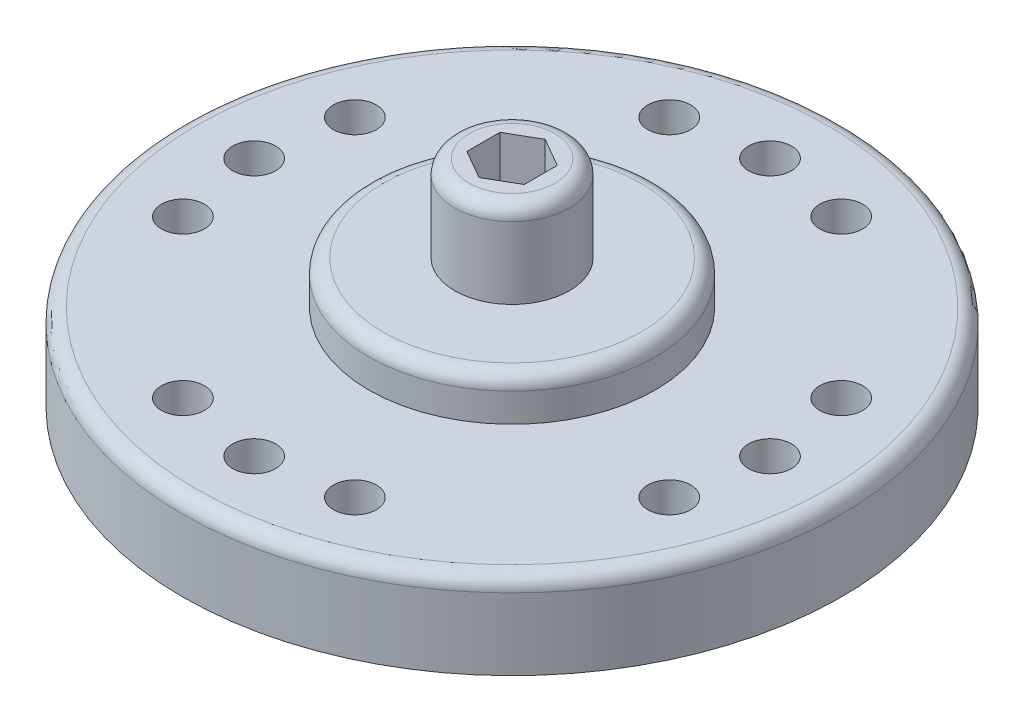
ISO-10303-21;
HEADER;
FILE_DESCRIPTION(('STEP AP214'),'2;1');
FILE_NAME('part.step','',(''),(''),'','','');
FILE_SCHEMA(('AUTOMOTIVE_DESIGN { 1 0 10303 214 1 1 1 1 }'));
ENDSEC;
DATA;
#1=APPLICATION_CONTEXT('core data for automotive mechanical design processes');
#2=APPLICATION_PROTOCOL_DEFINITION('international standard','automotive_design',2000,#1);
#3=PRODUCT_CONTEXT('',#1,'mechanical');
#4=PRODUCT('Part','Part','',(#3));
#5=PRODUCT_RELATED_PRODUCT_CATEGORY('part','',(#4));
#6=PRODUCT_DEFINITION_FORMATION('','',#4);
#7=PRODUCT_DEFINITION_CONTEXT('part definition',#1,'design');
#8=PRODUCT_DEFINITION('design','',#6,#7);
#9=PRODUCT_DEFINITION_SHAPE('','',#8);
#10=(LENGTH_UNIT() NAMED_UNIT(*) SI_UNIT(.MILLI.,.METRE.));
#11=(NAMED_UNIT(*) PLANE_ANGLE_UNIT() SI_UNIT($,.RADIAN.));
#12=(NAMED_UNIT(*) SI_UNIT($,.STERADIAN.) SOLID_ANGLE_UNIT());
#13=UNCERTAINTY_MEASURE_WITH_UNIT(LENGTH_MEASURE(1.E-05),#10,'distance_accuracy_value','');
#14=(GEOMETRIC_REPRESENTATION_CONTEXT(3) GLOBAL_UNCERTAINTY_ASSIGNED_CONTEXT((#13)) GLOBAL_UNIT_ASSIGNED_CONTEXT((#10,
#11,#12)) REPRESENTATION_CONTEXT('',''));
#15=CARTESIAN_POINT('',(0.,0.,0.));
#16=DIRECTION('',(0.,0.,1.));
#17=DIRECTION('',(1.,0.,0.));
#18=AXIS2_PLACEMENT_3D('',#15,#16,#17);
#19=CARTESIAN_POINT('',(0.,4.5,-13.3));
#20=DIRECTION('',(0.,1.,0.));
#21=DIRECTION('',(0.,0.,1.));
#22=AXIS2_PLACEMENT_3D('',#19,#20,#21);
#23=PLANE('',#22);
#24=CARTESIAN_POINT('',(0.,4.5,-13.3));
#25=DIRECTION('',(0.,1.,0.));
#26=DIRECTION('',(0.,0.,1.));
#27=AXIS2_PLACEMENT_3D('',#24,#25,#26);
#28=CIRCLE('',#27,4.5);
#29=CARTESIAN_POINT('',(0.,4.5,-8.79999999999999));
#30=VERTEX_POINT('',#29);
#31=EDGE_CURVE('E251',#30,#30,#28,.T.);
#32=ORIENTED_EDGE('',*,*,#31,.T.);
#33=EDGE_LOOP('',(#32));
#34=FACE_BOUND('',#33,.T.);
#35=CARTESIAN_POINT('',(0.,4.5,-13.3));
#36=DIRECTION('',(0.,1.,0.));
#37=DIRECTION('',(0.,0.,1.));
#38=AXIS2_PLACEMENT_3D('',#35,#36,#37);
#39=CIRCLE('',#38,2.);
#40=CARTESIAN_POINT('',(0.,4.5,-11.3));
#41=VERTEX_POINT('',#40);
#42=EDGE_CURVE('E157',#41,#41,#39,.T.);
#43=ORIENTED_EDGE('',*,*,#42,.F.);
#44=EDGE_LOOP('',(#43));
#45=FACE_BOUND('',#44,.T.);
#46=ADVANCED_FACE('F56',(#34,#45),#23,.T.);
#47=CARTESIAN_POINT('',(0.,3.,-13.3));
#48=DIRECTION('',(0.,1.,0.));
#49=DIRECTION('',(0.,0.,1.));
#50=AXIS2_PLACEMENT_3D('',#47,#48,#49);
#51=PLANE('',#50);
#52=CARTESIAN_POINT('',(0.,3.,-13.3));
#53=DIRECTION('',(0.,1.,0.));
#54=DIRECTION('',(0.,0.,1.));
#55=AXIS2_PLACEMENT_3D('',#52,#53,#54);
#56=CIRCLE('',#55,11.);
#57=CARTESIAN_POINT('',(0.,3.,-2.3));
#58=VERTEX_POINT('',#57);
#59=EDGE_CURVE('E257',#58,#58,#56,.T.);
#60=ORIENTED_EDGE('',*,*,#59,.T.);
#61=EDGE_LOOP('',(#60));
#62=FACE_BOUND('',#61,.T.);
#63=CARTESIAN_POINT('',(8.48528137423861,3.,-10.3000000000001));
#64=DIRECTION('',(0.,1.,0.));
#65=DIRECTION('',(-1.,0.,0.));
#66=AXIS2_PLACEMENT_3D('',#63,#64,#65);
#67=CIRCLE('',#66,0.75);
#68=CARTESIAN_POINT('',(7.7352813742386,3.,-10.3000000000001));
#69=VERTEX_POINT('',#68);
#70=EDGE_CURVE('E177',#69,#69,#67,.T.);
#71=ORIENTED_EDGE('',*,*,#70,.F.);
#72=EDGE_LOOP('',(#71));
#73=FACE_BOUND('',#72,.T.);
#74=CARTESIAN_POINT('',(-3.,3.,-4.81471862576142));
#75=DIRECTION('',(0.,1.,0.));
#76=DIRECTION('',(0.,0.,-1.));
#77=AXIS2_PLACEMENT_3D('',#74,#75,#76);
#78=CIRCLE('',#77,0.75);
#79=CARTESIAN_POINT('',(-3.,3.,-5.56471862576142));
#80=VERTEX_POINT('',#79);
#81=EDGE_CURVE('E195',#80,#80,#78,.T.);
#82=ORIENTED_EDGE('',*,*,#81,.F.);
#83=EDGE_LOOP('',(#82));
#84=FACE_BOUND('',#83,.T.);
#85=CARTESIAN_POINT('',(-8.48528137423858,3.,-16.3));
#86=DIRECTION('',(0.,1.,0.));
#87=DIRECTION('',(1.,0.,0.));
#88=AXIS2_PLACEMENT_3D('',#85,#86,#87);
#89=CIRCLE('',#88,0.75);
#90=CARTESIAN_POINT('',(-7.73528137423858,3.,-16.3));
#91=VERTEX_POINT('',#90);
#92=EDGE_CURVE('E213',#91,#91,#89,.T.);
#93=ORIENTED_EDGE('',*,*,#92,.F.);
#94=EDGE_LOOP('',(#93));
#95=FACE_BOUND('',#94,.T.);
#96=CARTESIAN_POINT('',(3.,3.,-21.7852813742386));
#97=DIRECTION('',(0.,1.,0.));
#98=DIRECTION('',(0.,0.,1.));
#99=AXIS2_PLACEMENT_3D('',#96,#97,#98);
#100=CIRCLE('',#99,0.75);
#101=CARTESIAN_POINT('',(3.,3.,-21.0352813742386));
#102=VERTEX_POINT('',#101);
#103=EDGE_CURVE('E228',#102,#102,#100,.T.);
#104=ORIENTED_EDGE('',*,*,#103,.F.);
#105=EDGE_LOOP('',(#104));
#106=FACE_BOUND('',#105,.T.);
#107=CARTESIAN_POINT('',(0.,3.,-22.3));
#108=DIRECTION('',(0.,1.,0.));
#109=DIRECTION('',(0.,0.,1.));
#110=AXIS2_PLACEMENT_3D('',#107,#108,#109);
#111=CIRCLE('',#110,0.750000000000001);
#112=CARTESIAN_POINT('',(0.,3.,-21.55));
#113=VERTEX_POINT('',#112);
#114=EDGE_CURVE('E237',#113,#113,#111,.T.);
#115=ORIENTED_EDGE('',*,*,#114,.F.);
#116=EDGE_LOOP('',(#115));
#117=FACE_BOUND('',#116,.T.);
#118=CARTESIAN_POINT('',(-3.,3.,-21.7852813742386));
#119=DIRECTION('',(0.,-1.,0.));
#120=DIRECTION('',(0.,0.,-1.));
#121=AXIS2_PLACEMENT_3D('',#118,#119,#120);
#122=CIRCLE('',#121,0.75);
#123=CARTESIAN_POINT('',(-3.,3.,-22.5352813742386));
#124=VERTEX_POINT('',#123);
#125=EDGE_CURVE('E222',#124,#124,#122,.T.);
#126=ORIENTED_EDGE('',*,*,#125,.T.);
#127=EDGE_LOOP('',(#126));
#128=FACE_BOUND('',#127,.T.);
#129=CARTESIAN_POINT('',(-9.,3.,-13.3));
#130=DIRECTION('',(0.,1.,0.));
#131=DIRECTION('',(1.,0.,0.));
#132=AXIS2_PLACEMENT_3D('',#129,#130,#131);
#133=CIRCLE('',#132,0.750000000000001);
#134=CARTESIAN_POINT('',(-8.24999999999999,3.,-13.3));
#135=VERTEX_POINT('',#134);
#136=EDGE_CURVE('E219',#135,#135,#133,.T.);
#137=ORIENTED_EDGE('',*,*,#136,.F.);
#138=EDGE_LOOP('',(#137));
#139=FACE_BOUND('',#138,.T.);
#140=CARTESIAN_POINT('',(-8.48528137423856,3.,-10.3));
#141=DIRECTION('',(0.,-1.,0.));
#142=DIRECTION('',(-1.,0.,0.));
#143=AXIS2_PLACEMENT_3D('',#140,#141,#142);
#144=CIRCLE('',#143,0.75);
#145=CARTESIAN_POINT('',(-9.23528137423856,3.,-10.3));
#146=VERTEX_POINT('',#145);
#147=EDGE_CURVE('E207',#146,#146,#144,.T.);
#148=ORIENTED_EDGE('',*,*,#147,.T.);
#149=EDGE_LOOP('',(#148));
#150=FACE_BOUND('',#149,.T.);
#151=CARTESIAN_POINT('',(0.,3.,-4.3));
#152=DIRECTION('',(0.,1.,0.));
#153=DIRECTION('',(0.,0.,-1.));
#154=AXIS2_PLACEMENT_3D('',#151,#152,#153);
#155=CIRCLE('',#154,0.750000000000001);
#156=CARTESIAN_POINT('',(0.,3.,-5.05));
#157=VERTEX_POINT('',#156);
#158=EDGE_CURVE('E201',#157,#157,#155,.T.);
#159=ORIENTED_EDGE('',*,*,#158,.F.);
#160=EDGE_LOOP('',(#159));
#161=FACE_BOUND('',#160,.T.);
#162=CARTESIAN_POINT('',(3.,3.,-4.81471862576142));
#163=DIRECTION('',(0.,-1.,0.));
#164=DIRECTION('',(0.,0.,1.));
#165=AXIS2_PLACEMENT_3D('',#162,#163,#164);
#166=CIRCLE('',#165,0.75);
#167=CARTESIAN_POINT('',(3.,3.,-4.06471862576142));
#168=VERTEX_POINT('',#167);
#169=EDGE_CURVE('E189',#168,#168,#166,.T.);
#170=ORIENTED_EDGE('',*,*,#169,.T.);
#171=EDGE_LOOP('',(#170));
#172=FACE_BOUND('',#171,.T.);
#173=CARTESIAN_POINT('',(9.,3.,-13.3000000000001));
#174=DIRECTION('',(0.,1.,0.));
#175=DIRECTION('',(-1.,0.,0.));
#176=AXIS2_PLACEMENT_3D('',#173,#174,#175);
#177=CIRCLE('',#176,0.750000000000001);
#178=CARTESIAN_POINT('',(8.25,3.,-13.3000000000001));
#179=VERTEX_POINT('',#178);
#180=EDGE_CURVE('E183',#179,#179,#177,.T.);
#181=ORIENTED_EDGE('',*,*,#180,.F.);
#182=EDGE_LOOP('',(#181));
#183=FACE_BOUND('',#182,.T.);
#184=CARTESIAN_POINT('',(8.48528137423854,3.,-16.3000000000001));
#185=DIRECTION('',(0.,-1.,0.));
#186=DIRECTION('',(1.,0.,0.));
#187=AXIS2_PLACEMENT_3D('',#184,#185,#186);
#188=CIRCLE('',#187,0.75);
#189=CARTESIAN_POINT('',(9.23528137423854,3.,-16.3000000000001));
#190=VERTEX_POINT('',#189);
#191=EDGE_CURVE('E171',#190,#190,#188,.T.);
#192=ORIENTED_EDGE('',*,*,#191,.T.);
#193=EDGE_LOOP('',(#192));
#194=FACE_BOUND('',#193,.T.);
#195=CARTESIAN_POINT('',(0.,3.,-13.3));
#196=DIRECTION('',(0.,1.,0.));
#197=DIRECTION('',(0.,0.,1.));
#198=AXIS2_PLACEMENT_3D('',#195,#196,#197);
#199=CIRCLE('',#198,5.);
#200=CARTESIAN_POINT('',(0.,3.,-8.29999999999999));
#201=VERTEX_POINT('',#200);
#202=EDGE_CURVE('E167',#201,#201,#199,.T.);
#203=ORIENTED_EDGE('',*,*,#202,.F.);
#204=EDGE_LOOP('',(#203));
#205=FACE_BOUND('',#204,.T.);
#206=ADVANCED_FACE('F271',(#62,#73,#84,#95,#106,#117,#128,#139,#150,#161,#172,#183,#194,#205),
#51,.T.);
#207=CARTESIAN_POINT('',(0.,0.,-13.3));
#208=DIRECTION('',(0.,1.,0.));
#209=DIRECTION('',(0.,0.,1.));
#210=AXIS2_PLACEMENT_3D('',#207,#208,#209);
#211=PLANE('',#210);
#212=CARTESIAN_POINT('',(0.,0.,-13.3));
#213=DIRECTION('',(0.,1.,0.));
#214=DIRECTION('',(0.,0.,1.));
#215=AXIS2_PLACEMENT_3D('',#212,#213,#214);
#216=CIRCLE('',#215,5.);
#217=CARTESIAN_POINT('',(0.,0.,-8.29999999999999));
#218=VERTEX_POINT('',#217);
#219=EDGE_CURVE('E133',#218,#218,#216,.T.);
#220=ORIENTED_EDGE('',*,*,#219,.T.);
#221=EDGE_LOOP('',(#220));
#222=FACE_BOUND('',#221,.T.);
#223=CARTESIAN_POINT('',(8.48528137423854,0.,-16.3000000000001));
#224=DIRECTION('',(0.,-1.,0.));
#225=DIRECTION('',(1.,0.,0.));
#226=AXIS2_PLACEMENT_3D('',#223,#224,#225);
#227=CIRCLE('',#226,0.75);
#228=CARTESIAN_POINT('',(9.23528137423854,0.,-16.3000000000001));
#229=VERTEX_POINT('',#228);
#230=EDGE_CURVE('E170',#229,#229,#227,.T.);
#231=ORIENTED_EDGE('',*,*,#230,.F.);
#232=EDGE_LOOP('',(#231));
#233=FACE_BOUND('',#232,.T.);
#234=CARTESIAN_POINT('',(3.,0.,-4.81471862576142));
#235=DIRECTION('',(0.,-1.,0.));
#236=DIRECTION('',(0.,0.,1.));
#237=AXIS2_PLACEMENT_3D('',#234,#235,#236);
#238=CIRCLE('',#237,0.75);
#239=CARTESIAN_POINT('',(3.,0.,-4.06471862576142));
#240=VERTEX_POINT('',#239);
#241=EDGE_CURVE('E186',#240,#240,#238,.T.);
#242=ORIENTED_EDGE('',*,*,#241,.F.);
#243=EDGE_LOOP('',(#242));
#244=FACE_BOUND('',#243,.T.);
#245=CARTESIAN_POINT('',(-8.48528137423856,0.,-10.3));
#246=DIRECTION('',(0.,-1.,0.));
#247=DIRECTION('',(-1.,0.,0.));
#248=AXIS2_PLACEMENT_3D('',#245,#246,#247);
#249=CIRCLE('',#248,0.75);
#250=CARTESIAN_POINT('',(-9.23528137423856,0.,-10.3));
#251=VERTEX_POINT('',#250);
#252=EDGE_CURVE('E204',#251,#251,#249,.T.);
#253=ORIENTED_EDGE('',*,*,#252,.F.);
#254=EDGE_LOOP('',(#253));
#255=FACE_BOUND('',#254,.T.);
#256=CARTESIAN_POINT('',(-3.,0.,-21.7852813742386));
#257=DIRECTION('',(0.,-1.,0.));
#258=DIRECTION('',(0.,0.,-1.));
#259=AXIS2_PLACEMENT_3D('',#256,#257,#258);
#260=CIRCLE('',#259,0.75);
#261=CARTESIAN_POINT('',(-3.,0.,-22.5352813742386));
#262=VERTEX_POINT('',#261);
#263=EDGE_CURVE('E225',#262,#262,#260,.T.);
#264=ORIENTED_EDGE('',*,*,#263,.F.);
#265=EDGE_LOOP('',(#264));
#266=FACE_BOUND('',#265,.T.);
#267=CARTESIAN_POINT('',(0.,0.,-13.3));
#268=DIRECTION('',(0.,1.,0.));
#269=DIRECTION('',(0.,0.,1.));
#270=AXIS2_PLACEMENT_3D('',#267,#268,#269);
#271=CIRCLE('',#270,11.5);
#272=CARTESIAN_POINT('',(0.,0.,-1.8));
#273=VERTEX_POINT('',#272);
#274=EDGE_CURVE('E240',#273,#273,#271,.T.);
#275=ORIENTED_EDGE('',*,*,#274,.F.);
#276=EDGE_LOOP('',(#275));
#277=FACE_BOUND('',#276,.T.);
#278=CARTESIAN_POINT('',(0.,0.,-22.3));
#279=DIRECTION('',(0.,1.,0.));
#280=DIRECTION('',(0.,0.,1.));
#281=AXIS2_PLACEMENT_3D('',#278,#279,#280);
#282=CIRCLE('',#281,0.750000000000001);
#283=CARTESIAN_POINT('',(0.,0.,-21.55));
#284=VERTEX_POINT('',#283);
#285=EDGE_CURVE('E234',#284,#284,#282,.T.);
#286=ORIENTED_EDGE('',*,*,#285,.T.);
#287=EDGE_LOOP('',(#286));
#288=FACE_BOUND('',#287,.T.);
#289=CARTESIAN_POINT('',(3.,0.,-21.7852813742386));
#290=DIRECTION('',(0.,1.,0.));
#291=DIRECTION('',(0.,0.,1.));
#292=AXIS2_PLACEMENT_3D('',#289,#290,#291);
#293=CIRCLE('',#292,0.75);
#294=CARTESIAN_POINT('',(3.,0.,-21.0352813742386));
#295=VERTEX_POINT('',#294);
#296=EDGE_CURVE('E231',#295,#295,#293,.T.);
#297=ORIENTED_EDGE('',*,*,#296,.T.);
#298=EDGE_LOOP('',(#297));
#299=FACE_BOUND('',#298,.T.);
#300=CARTESIAN_POINT('',(-9.,0.,-13.3));
#301=DIRECTION('',(0.,1.,0.));
#302=DIRECTION('',(1.,0.,0.));
#303=AXIS2_PLACEMENT_3D('',#300,#301,#302);
#304=CIRCLE('',#303,0.750000000000001);
#305=CARTESIAN_POINT('',(-8.24999999999999,0.,-13.3));
#306=VERTEX_POINT('',#305);
#307=EDGE_CURVE('E216',#306,#306,#304,.T.);
#308=ORIENTED_EDGE('',*,*,#307,.T.);
#309=EDGE_LOOP('',(#308));
#310=FACE_BOUND('',#309,.T.);
#311=CARTESIAN_POINT('',(-8.48528137423858,0.,-16.3));
#312=DIRECTION('',(0.,1.,0.));
#313=DIRECTION('',(1.,0.,0.));
#314=AXIS2_PLACEMENT_3D('',#311,#312,#313);
#315=CIRCLE('',#314,0.75);
#316=CARTESIAN_POINT('',(-7.73528137423858,0.,-16.3));
#317=VERTEX_POINT('',#316);
#318=EDGE_CURVE('E210',#317,#317,#315,.T.);
#319=ORIENTED_EDGE('',*,*,#318,.T.);
#320=EDGE_LOOP('',(#319));
#321=FACE_BOUND('',#320,.T.);
#322=CARTESIAN_POINT('',(0.,0.,-4.3));
#323=DIRECTION('',(0.,1.,0.));
#324=DIRECTION('',(0.,0.,-1.));
#325=AXIS2_PLACEMENT_3D('',#322,#323,#324);
#326=CIRCLE('',#325,0.750000000000001);
#327=CARTESIAN_POINT('',(0.,0.,-5.05));
#328=VERTEX_POINT('',#327);
#329=EDGE_CURVE('E198',#328,#328,#326,.T.);
#330=ORIENTED_EDGE('',*,*,#329,.T.);
#331=EDGE_LOOP('',(#330));
#332=FACE_BOUND('',#331,.T.);
#333=CARTESIAN_POINT('',(-3.,0.,-4.81471862576142));
#334=DIRECTION('',(0.,1.,0.));
#335=DIRECTION('',(0.,0.,-1.));
#336=AXIS2_PLACEMENT_3D('',#333,#334,#335);
#337=CIRCLE('',#336,0.75);
#338=CARTESIAN_POINT('',(-3.,0.,-5.56471862576142));
#339=VERTEX_POINT('',#338);
#340=EDGE_CURVE('E192',#339,#339,#337,.T.);
#341=ORIENTED_EDGE('',*,*,#340,.T.);
#342=EDGE_LOOP('',(#341));
#343=FACE_BOUND('',#342,.T.);
#344=CARTESIAN_POINT('',(9.,0.,-13.3000000000001));
#345=DIRECTION('',(0.,1.,0.));
#346=DIRECTION('',(-1.,0.,0.));
#347=AXIS2_PLACEMENT_3D('',#344,#345,#346);
#348=CIRCLE('',#347,0.750000000000001);
#349=CARTESIAN_POINT('',(8.25,0.,-13.3000000000001));
#350=VERTEX_POINT('',#349);
#351=EDGE_CURVE('E180',#350,#350,#348,.T.);
#352=ORIENTED_EDGE('',*,*,#351,.T.);
#353=EDGE_LOOP('',(#352));
#354=FACE_BOUND('',#353,.T.);
#355=CARTESIAN_POINT('',(8.48528137423861,0.,-10.3000000000001));
#356=DIRECTION('',(0.,1.,0.));
#357=DIRECTION('',(-1.,0.,0.));
#358=AXIS2_PLACEMENT_3D('',#355,#356,#357);
#359=CIRCLE('',#358,0.75);
#360=CARTESIAN_POINT('',(7.7352813742386,0.,-10.3000000000001));
#361=VERTEX_POINT('',#360);
#362=EDGE_CURVE('E174',#361,#361,#359,.T.);
#363=ORIENTED_EDGE('',*,*,#362,.T.);
#364=EDGE_LOOP('',(#363));
#365=FACE_BOUND('',#364,.T.);
#366=ADVANCED_FACE('F274',(#222,#233,#244,#255,#266,#277,#288,#299,#310,#321,#332,#343,#354,
#365),#211,.F.);
#367=CARTESIAN_POINT('',(0.,3.,-13.3));
#368=DIRECTION('',(0.,-1.,0.));
#369=DIRECTION('',(0.,0.,-1.));
#370=AXIS2_PLACEMENT_3D('',#367,#368,#369);
#371=CYLINDRICAL_SURFACE('',#370,11.5);
#372=CARTESIAN_POINT('',(0.,2.5,-13.3));
#373=DIRECTION('',(0.,1.,0.));
#374=DIRECTION('',(0.,0.,1.));
#375=AXIS2_PLACEMENT_3D('',#372,#373,#374);
#376=CIRCLE('',#375,11.5);
#377=CARTESIAN_POINT('',(0.,2.5,-1.8));
#378=VERTEX_POINT('',#377);
#379=EDGE_CURVE('E64',#378,#378,#376,.F.);
#380=ORIENTED_EDGE('',*,*,#379,.T.);
#381=EDGE_LOOP('',(#380));
#382=FACE_BOUND('',#381,.T.);
#383=ORIENTED_EDGE('',*,*,#274,.T.);
#384=EDGE_LOOP('',(#383));
#385=FACE_BOUND('',#384,.T.);
#386=ADVANCED_FACE('F262',(#382,#385),#371,.T.);
#387=CARTESIAN_POINT('',(0.,3.,-22.3));
#388=DIRECTION('',(0.,-1.,0.));
#389=DIRECTION('',(0.,0.,-1.));
#390=AXIS2_PLACEMENT_3D('',#387,#388,#389);
#391=CYLINDRICAL_SURFACE('',#390,0.750000000000001);
#392=ORIENTED_EDGE('',*,*,#114,.T.);
#393=EDGE_LOOP('',(#392));
#394=FACE_BOUND('',#393,.T.);
#395=ORIENTED_EDGE('',*,*,#285,.F.);
#396=EDGE_LOOP('',(#395));
#397=FACE_BOUND('',#396,.T.);
#398=ADVANCED_FACE('F433',(#394,#397),#391,.F.);
#399=CARTESIAN_POINT('',(3.,3.,-21.7852813742386));
#400=DIRECTION('',(0.,-1.,0.));
#401=DIRECTION('',(0.,0.,-1.));
#402=AXIS2_PLACEMENT_3D('',#399,#400,#401);
#403=CYLINDRICAL_SURFACE('',#402,0.75);
#404=ORIENTED_EDGE('',*,*,#103,.T.);
#405=EDGE_LOOP('',(#404));
#406=FACE_BOUND('',#405,.T.);
#407=ORIENTED_EDGE('',*,*,#296,.F.);
#408=EDGE_LOOP('',(#407));
#409=FACE_BOUND('',#408,.T.);
#410=ADVANCED_FACE('F453',(#406,#409),#403,.F.);
#411=CARTESIAN_POINT('',(-3.,3.,-21.7852813742386));
#412=DIRECTION('',(0.,-1.,0.));
#413=DIRECTION('',(0.,0.,-1.));
#414=AXIS2_PLACEMENT_3D('',#411,#412,#413);
#415=CYLINDRICAL_SURFACE('',#414,0.75);
#416=ORIENTED_EDGE('',*,*,#125,.F.);
#417=EDGE_LOOP('',(#416));
#418=FACE_BOUND('',#417,.T.);
#419=ORIENTED_EDGE('',*,*,#263,.T.);
#420=EDGE_LOOP('',(#419));
#421=FACE_BOUND('',#420,.T.);
#422=ADVANCED_FACE('F460',(#418,#421),#415,.F.);
#423=CARTESIAN_POINT('',(-9.,3.,-13.3));
#424=DIRECTION('',(0.,-1.,0.));
#425=DIRECTION('',(0.,0.,-1.));
#426=AXIS2_PLACEMENT_3D('',#423,#424,#425);
#427=CYLINDRICAL_SURFACE('',#426,0.750000000000001);
#428=ORIENTED_EDGE('',*,*,#136,.T.);
#429=EDGE_LOOP('',(#428));
#430=FACE_BOUND('',#429,.T.);
#431=ORIENTED_EDGE('',*,*,#307,.F.);
#432=EDGE_LOOP('',(#431));
#433=FACE_BOUND('',#432,.T.);
#434=ADVANCED_FACE('F468',(#430,#433),#427,.F.);
#435=CARTESIAN_POINT('',(-8.48528137423858,3.,-16.3));
#436=DIRECTION('',(0.,-1.,0.));
#437=DIRECTION('',(0.,0.,-1.));
#438=AXIS2_PLACEMENT_3D('',#435,#436,#437);
#439=CYLINDRICAL_SURFACE('',#438,0.75);
#440=ORIENTED_EDGE('',*,*,#92,.T.);
#441=EDGE_LOOP('',(#440));
#442=FACE_BOUND('',#441,.T.);
#443=ORIENTED_EDGE('',*,*,#318,.F.);
#444=EDGE_LOOP('',(#443));
#445=FACE_BOUND('',#444,.T.);
#446=ADVANCED_FACE('F476',(#442,#445),#439,.F.);
#447=CARTESIAN_POINT('',(-8.48528137423856,3.,-10.3));
#448=DIRECTION('',(0.,-1.,0.));
#449=DIRECTION('',(0.,0.,-1.));
#450=AXIS2_PLACEMENT_3D('',#447,#448,#449);
#451=CYLINDRICAL_SURFACE('',#450,0.75);
#452=ORIENTED_EDGE('',*,*,#147,.F.);
#453=EDGE_LOOP('',(#452));
#454=FACE_BOUND('',#453,.T.);
#455=ORIENTED_EDGE('',*,*,#252,.T.);
#456=EDGE_LOOP('',(#455));
#457=FACE_BOUND('',#456,.T.);
#458=ADVANCED_FACE('F484',(#454,#457),#451,.F.);
#459=CARTESIAN_POINT('',(0.,3.,-4.3));
#460=DIRECTION('',(0.,-1.,0.));
#461=DIRECTION('',(0.,0.,-1.));
#462=AXIS2_PLACEMENT_3D('',#459,#460,#461);
#463=CYLINDRICAL_SURFACE('',#462,0.750000000000001);
#464=ORIENTED_EDGE('',*,*,#158,.T.);
#465=EDGE_LOOP('',(#464));
#466=FACE_BOUND('',#465,.T.);
#467=ORIENTED_EDGE('',*,*,#329,.F.);
#468=EDGE_LOOP('',(#467));
#469=FACE_BOUND('',#468,.T.);
#470=ADVANCED_FACE('F492',(#466,#469),#463,.F.);
#471=CARTESIAN_POINT('',(-3.,3.,-4.81471862576142));
#472=DIRECTION('',(0.,-1.,0.));
#473=DIRECTION('',(0.,0.,-1.));
#474=AXIS2_PLACEMENT_3D('',#471,#472,#473);
#475=CYLINDRICAL_SURFACE('',#474,0.75);
#476=ORIENTED_EDGE('',*,*,#81,.T.);
#477=EDGE_LOOP('',(#476));
#478=FACE_BOUND('',#477,.T.);
#479=ORIENTED_EDGE('',*,*,#340,.F.);
#480=EDGE_LOOP('',(#479));
#481=FACE_BOUND('',#480,.T.);
#482=ADVANCED_FACE('F500',(#478,#481),#475,.F.);
#483=CARTESIAN_POINT('',(3.,3.,-4.81471862576142));
#484=DIRECTION('',(0.,-1.,0.));
#485=DIRECTION('',(0.,0.,-1.));
#486=AXIS2_PLACEMENT_3D('',#483,#484,#485);
#487=CYLINDRICAL_SURFACE('',#486,0.75);
#488=ORIENTED_EDGE('',*,*,#169,.F.);
#489=EDGE_LOOP('',(#488));
#490=FACE_BOUND('',#489,.T.);
#491=ORIENTED_EDGE('',*,*,#241,.T.);
#492=EDGE_LOOP('',(#491));
#493=FACE_BOUND('',#492,.T.);
#494=ADVANCED_FACE('F508',(#490,#493),#487,.F.);
#495=CARTESIAN_POINT('',(9.,3.,-13.3000000000001));
#496=DIRECTION('',(0.,-1.,0.));
#497=DIRECTION('',(0.,0.,-1.));
#498=AXIS2_PLACEMENT_3D('',#495,#496,#497);
#499=CYLINDRICAL_SURFACE('',#498,0.750000000000001);
#500=ORIENTED_EDGE('',*,*,#180,.T.);
#501=EDGE_LOOP('',(#500));
#502=FACE_BOUND('',#501,.T.);
#503=ORIENTED_EDGE('',*,*,#351,.F.);
#504=EDGE_LOOP('',(#503));
#505=FACE_BOUND('',#504,.T.);
#506=ADVANCED_FACE('F516',(#502,#505),#499,.F.);
#507=CARTESIAN_POINT('',(8.48528137423861,3.,-10.3000000000001));
#508=DIRECTION('',(0.,-1.,0.));
#509=DIRECTION('',(0.,0.,-1.));
#510=AXIS2_PLACEMENT_3D('',#507,#508,#509);
#511=CYLINDRICAL_SURFACE('',#510,0.75);
#512=ORIENTED_EDGE('',*,*,#70,.T.);
#513=EDGE_LOOP('',(#512));
#514=FACE_BOUND('',#513,.T.);
#515=ORIENTED_EDGE('',*,*,#362,.F.);
#516=EDGE_LOOP('',(#515));
#517=FACE_BOUND('',#516,.T.);
#518=ADVANCED_FACE('F314',(#514,#517),#511,.F.);
#519=CARTESIAN_POINT('',(8.48528137423854,3.,-16.3000000000001));
#520=DIRECTION('',(0.,-1.,0.));
#521=DIRECTION('',(0.,0.,-1.));
#522=AXIS2_PLACEMENT_3D('',#519,#520,#521);
#523=CYLINDRICAL_SURFACE('',#522,0.75);
#524=ORIENTED_EDGE('',*,*,#191,.F.);
#525=EDGE_LOOP('',(#524));
#526=FACE_BOUND('',#525,.T.);
#527=ORIENTED_EDGE('',*,*,#230,.T.);
#528=EDGE_LOOP('',(#527));
#529=FACE_BOUND('',#528,.T.);
#530=ADVANCED_FACE('F305',(#526,#529),#523,.F.);
#531=CARTESIAN_POINT('',(0.,4.5,-13.3));
#532=DIRECTION('',(0.,-1.,0.));
#533=DIRECTION('',(0.,0.,-1.));
#534=AXIS2_PLACEMENT_3D('',#531,#532,#533);
#535=CYLINDRICAL_SURFACE('',#534,5.);
#536=CARTESIAN_POINT('',(0.,4.,-13.3));
#537=DIRECTION('',(0.,1.,0.));
#538=DIRECTION('',(0.,0.,1.));
#539=AXIS2_PLACEMENT_3D('',#536,#537,#538);
#540=CIRCLE('',#539,5.);
#541=CARTESIAN_POINT('',(0.,4.,-8.29999999999999));
#542=VERTEX_POINT('',#541);
#543=EDGE_CURVE('E254',#542,#542,#540,.F.);
#544=ORIENTED_EDGE('',*,*,#543,.T.);
#545=EDGE_LOOP('',(#544));
#546=FACE_BOUND('',#545,.T.);
#547=ORIENTED_EDGE('',*,*,#202,.T.);
#548=EDGE_LOOP('',(#547));
#549=FACE_BOUND('',#548,.T.);
#550=ADVANCED_FACE('F302',(#546,#549),#535,.T.);
#551=CARTESIAN_POINT('',(0.,7.5,-13.3));
#552=DIRECTION('',(0.,-1.,0.));
#553=DIRECTION('',(0.,0.,-1.));
#554=AXIS2_PLACEMENT_3D('',#551,#552,#553);
#555=CYLINDRICAL_SURFACE('',#554,2.);
#556=CARTESIAN_POINT('',(0.,7.,-13.3));
#557=DIRECTION('',(0.,1.,0.));
#558=DIRECTION('',(0.,0.,1.));
#559=AXIS2_PLACEMENT_3D('',#556,#557,#558);
#560=CIRCLE('',#559,2.);
#561=CARTESIAN_POINT('',(0.,7.,-11.3));
#562=VERTEX_POINT('',#561);
#563=EDGE_CURVE('E248',#562,#562,#560,.F.);
#564=ORIENTED_EDGE('',*,*,#563,.T.);
#565=EDGE_LOOP('',(#564));
#566=FACE_BOUND('',#565,.T.);
#567=ORIENTED_EDGE('',*,*,#42,.T.);
#568=EDGE_LOOP('',(#567));
#569=FACE_BOUND('',#568,.T.);
#570=ADVANCED_FACE('F304',(#566,#569),#555,.T.);
#571=CARTESIAN_POINT('',(0.,7.5,-13.3));
#572=DIRECTION('',(0.,1.,0.));
#573=DIRECTION('',(0.,0.,1.));
#574=AXIS2_PLACEMENT_3D('',#571,#572,#573);
#575=PLANE('',#574);
#576=CARTESIAN_POINT('',(0.,7.5,-13.3));
#577=DIRECTION('',(0.,1.,0.));
#578=DIRECTION('',(0.,0.,1.));
#579=AXIS2_PLACEMENT_3D('',#576,#577,#578);
#580=CIRCLE('',#579,1.5);
#581=CARTESIAN_POINT('',(0.,7.5,-11.8));
#582=VERTEX_POINT('',#581);
#583=EDGE_CURVE('E245',#582,#582,#580,.T.);
#584=ORIENTED_EDGE('',*,*,#583,.T.);
#585=EDGE_LOOP('',(#584));
#586=FACE_BOUND('',#585,.T.);
#587=DIRECTION('',(0.,0.,1.));
#588=VECTOR('',#587,1.);
#589=CARTESIAN_POINT('',(1.00000000000001,7.5,-13.3));
#590=LINE('',#589,#588);
#591=CARTESIAN_POINT('',(1.00000000000001,7.5,-13.8773502691896));
#592=VERTEX_POINT('',#591);
#593=CARTESIAN_POINT('',(1.00000000000001,7.5,-12.7226497308104));
#594=VERTEX_POINT('',#593);
#595=EDGE_CURVE('E111',#592,#594,#590,.T.);
#596=ORIENTED_EDGE('',*,*,#595,.T.);
#597=DIRECTION('',(-0.866025403784439,0.,0.5));
#598=VECTOR('',#597,1.);
#599=CARTESIAN_POINT('',(0.500000000000003,7.5,-12.4339745962156));
#600=LINE('',#599,#598);
#601=CARTESIAN_POINT('',(0.,7.5,-12.1452994616207));
#602=VERTEX_POINT('',#601);
#603=EDGE_CURVE('E120',#594,#602,#600,.T.);
#604=ORIENTED_EDGE('',*,*,#603,.T.);
#605=DIRECTION('',(-0.866025403784439,0.,-0.5));
#606=VECTOR('',#605,1.);
#607=CARTESIAN_POINT('',(-0.499999999999997,7.5,-12.4339745962156));
#608=LINE('',#607,#606);
#609=CARTESIAN_POINT('',(-1.00000000000001,7.5,-12.7226497308104));
#610=VERTEX_POINT('',#609);
#611=EDGE_CURVE('E79',#602,#610,#608,.T.);
#612=ORIENTED_EDGE('',*,*,#611,.T.);
#613=DIRECTION('',(0.,0.,-1.));
#614=VECTOR('',#613,1.);
#615=CARTESIAN_POINT('',(-1.00000000000001,7.5,-13.3));
#616=LINE('',#615,#614);
#617=CARTESIAN_POINT('',(-1.00000000000001,7.5,-13.8773502691896));
#618=VERTEX_POINT('',#617);
#619=EDGE_CURVE('E137',#610,#618,#616,.T.);
#620=ORIENTED_EDGE('',*,*,#619,.T.);
#621=DIRECTION('',(0.866025403784439,0.,-0.5));
#622=VECTOR('',#621,1.);
#623=CARTESIAN_POINT('',(-0.500000000000002,7.5,-14.1660254037844));
#624=LINE('',#623,#622);
#625=CARTESIAN_POINT('',(0.,7.5,-14.4547005383793));
#626=VERTEX_POINT('',#625);
#627=EDGE_CURVE('E140',#618,#626,#624,.T.);
#628=ORIENTED_EDGE('',*,*,#627,.T.);
#629=DIRECTION('',(0.866025403784439,0.,0.5));
#630=VECTOR('',#629,1.);
#631=CARTESIAN_POINT('',(0.500000000000004,7.5,-14.1660254037844));
#632=LINE('',#631,#630);
#633=EDGE_CURVE('E117',#626,#592,#632,.T.);
#634=ORIENTED_EDGE('',*,*,#633,.T.);
#635=EDGE_LOOP('',(#596,#604,#612,#620,#628,#634));
#636=FACE_BOUND('',#635,.T.);
#637=ADVANCED_FACE('F124',(#586,#636),#575,.T.);
#638=CARTESIAN_POINT('',(1.00000000000001,7.5,-13.3));
#639=DIRECTION('',(1.,0.,0.));
#640=DIRECTION('',(0.,0.,-1.));
#641=AXIS2_PLACEMENT_3D('',#638,#639,#640);
#642=PLANE('',#641);
#643=DIRECTION('',(0.,0.,1.));
#644=VECTOR('',#643,1.);
#645=CARTESIAN_POINT('',(1.00000000000001,4.5,-13.3));
#646=LINE('',#645,#644);
#647=CARTESIAN_POINT('',(1.00000000000001,4.5,-13.8773502691896));
#648=VERTEX_POINT('',#647);
#649=CARTESIAN_POINT('',(1.00000000000001,4.5,-12.7226497308104));
#650=VERTEX_POINT('',#649);
#651=EDGE_CURVE('E114',#648,#650,#646,.T.);
#652=ORIENTED_EDGE('',*,*,#651,.T.);
#653=DIRECTION('',(0.,-1.,0.));
#654=VECTOR('',#653,1.);
#655=CARTESIAN_POINT('',(1.00000000000001,7.5,-12.7226497308104));
#656=LINE('',#655,#654);
#657=EDGE_CURVE('E71',#594,#650,#656,.T.);
#658=ORIENTED_EDGE('',*,*,#657,.F.);
#659=ORIENTED_EDGE('',*,*,#595,.F.);
#660=DIRECTION('',(0.,-1.,0.));
#661=VECTOR('',#660,1.);
#662=CARTESIAN_POINT('',(1.00000000000001,7.5,-13.8773502691896));
#663=LINE('',#662,#661);
#664=EDGE_CURVE('E155',#592,#648,#663,.T.);
#665=ORIENTED_EDGE('',*,*,#664,.T.);
#666=EDGE_LOOP('',(#652,#658,#659,#665));
#667=FACE_BOUND('',#666,.T.);
#668=ADVANCED_FACE('F109',(#667),#642,.F.);
#669=CARTESIAN_POINT('',(0.500000000000004,7.5,-14.1660254037844));
#670=DIRECTION('',(0.5,0.,-0.866025403784439));
#671=DIRECTION('',(-0.866025403784439,0.,-0.5));
#672=AXIS2_PLACEMENT_3D('',#669,#670,#671);
#673=PLANE('',#672);
#674=DIRECTION('',(0.866025403784439,0.,0.5));
#675=VECTOR('',#674,1.);
#676=CARTESIAN_POINT('',(0.500000000000004,4.5,-14.1660254037844));
#677=LINE('',#676,#675);
#678=CARTESIAN_POINT('',(0.,4.5,-14.4547005383793));
#679=VERTEX_POINT('',#678);
#680=EDGE_CURVE('E127',#679,#648,#677,.T.);
#681=ORIENTED_EDGE('',*,*,#680,.T.);
#682=ORIENTED_EDGE('',*,*,#664,.F.);
#683=ORIENTED_EDGE('',*,*,#633,.F.);
#684=DIRECTION('',(0.,-1.,0.));
#685=VECTOR('',#684,1.);
#686=CARTESIAN_POINT('',(0.,7.5,-14.4547005383793));
#687=LINE('',#686,#685);
#688=EDGE_CURVE('E158',#626,#679,#687,.T.);
#689=ORIENTED_EDGE('',*,*,#688,.T.);
#690=EDGE_LOOP('',(#681,#682,#683,#689));
#691=FACE_BOUND('',#690,.T.);
#692=ADVANCED_FACE('F346',(#691),#673,.F.);
#693=CARTESIAN_POINT('',(-0.500000000000002,7.5,-14.1660254037844));
#694=DIRECTION('',(-0.5,0.,-0.866025403784438));
#695=DIRECTION('',(-0.866025403784439,0.,0.5));
#696=AXIS2_PLACEMENT_3D('',#693,#694,#695);
#697=PLANE('',#696);
#698=DIRECTION('',(0.866025403784439,0.,-0.5));
#699=VECTOR('',#698,1.);
#700=CARTESIAN_POINT('',(-0.500000000000002,4.5,-14.1660254037844));
#701=LINE('',#700,#699);
#702=CARTESIAN_POINT('',(-1.00000000000001,4.5,-13.8773502691896));
#703=VERTEX_POINT('',#702);
#704=EDGE_CURVE('E130',#703,#679,#701,.T.);
#705=ORIENTED_EDGE('',*,*,#704,.T.);
#706=ORIENTED_EDGE('',*,*,#688,.F.);
#707=ORIENTED_EDGE('',*,*,#627,.F.);
#708=DIRECTION('',(0.,-1.,0.));
#709=VECTOR('',#708,1.);
#710=CARTESIAN_POINT('',(-1.00000000000001,7.5,-13.8773502691896));
#711=LINE('',#710,#709);
#712=EDGE_CURVE('E160',#618,#703,#711,.T.);
#713=ORIENTED_EDGE('',*,*,#712,.T.);
#714=EDGE_LOOP('',(#705,#706,#707,#713));
#715=FACE_BOUND('',#714,.T.);
#716=ADVANCED_FACE('F344',(#715),#697,.F.);
#717=CARTESIAN_POINT('',(-1.00000000000001,7.5,-13.3));
#718=DIRECTION('',(-1.,0.,0.));
#719=DIRECTION('',(0.,0.,1.));
#720=AXIS2_PLACEMENT_3D('',#717,#718,#719);
#721=PLANE('',#720);
#722=DIRECTION('',(0.,0.,-1.));
#723=VECTOR('',#722,1.);
#724=CARTESIAN_POINT('',(-1.00000000000001,4.5,-13.3));
#725=LINE('',#724,#723);
#726=CARTESIAN_POINT('',(-1.00000000000001,4.5,-12.7226497308104));
#727=VERTEX_POINT('',#726);
#728=EDGE_CURVE('E150',#727,#703,#725,.T.);
#729=ORIENTED_EDGE('',*,*,#728,.T.);
#730=ORIENTED_EDGE('',*,*,#712,.F.);
#731=ORIENTED_EDGE('',*,*,#619,.F.);
#732=DIRECTION('',(0.,-1.,0.));
#733=VECTOR('',#732,1.);
#734=CARTESIAN_POINT('',(-1.00000000000001,7.5,-12.7226497308104));
#735=LINE('',#734,#733);
#736=EDGE_CURVE('E162',#610,#727,#735,.T.);
#737=ORIENTED_EDGE('',*,*,#736,.T.);
#738=EDGE_LOOP('',(#729,#730,#731,#737));
#739=FACE_BOUND('',#738,.T.);
#740=ADVANCED_FACE('F341',(#739),#721,.F.);
#741=CARTESIAN_POINT('',(-0.499999999999997,7.5,-12.4339745962156));
#742=DIRECTION('',(-0.499999999999999,0.,0.866025403784439));
#743=DIRECTION('',(0.866025403784439,0.,0.499999999999999));
#744=AXIS2_PLACEMENT_3D('',#741,#742,#743);
#745=PLANE('',#744);
#746=DIRECTION('',(-0.866025403784439,0.,-0.5));
#747=VECTOR('',#746,1.);
#748=CARTESIAN_POINT('',(-0.499999999999997,4.5,-12.4339745962156));
#749=LINE('',#748,#747);
#750=CARTESIAN_POINT('',(0.,4.5,-12.1452994616207));
#751=VERTEX_POINT('',#750);
#752=EDGE_CURVE('E147',#751,#727,#749,.T.);
#753=ORIENTED_EDGE('',*,*,#752,.T.);
#754=ORIENTED_EDGE('',*,*,#736,.F.);
#755=ORIENTED_EDGE('',*,*,#611,.F.);
#756=DIRECTION('',(0.,-1.,0.));
#757=VECTOR('',#756,1.);
#758=CARTESIAN_POINT('',(0.,7.5,-12.1452994616207));
#759=LINE('',#758,#757);
#760=EDGE_CURVE('E116',#602,#751,#759,.T.);
#761=ORIENTED_EDGE('',*,*,#760,.T.);
#762=EDGE_LOOP('',(#753,#754,#755,#761));
#763=FACE_BOUND('',#762,.T.);
#764=ADVANCED_FACE('F333',(#763),#745,.F.);
#765=CARTESIAN_POINT('',(0.500000000000003,7.5,-12.4339745962156));
#766=DIRECTION('',(0.5,0.,0.866025403784439));
#767=DIRECTION('',(0.866025403784439,0.,-0.5));
#768=AXIS2_PLACEMENT_3D('',#765,#766,#767);
#769=PLANE('',#768);
#770=DIRECTION('',(-0.866025403784439,0.,0.5));
#771=VECTOR('',#770,1.);
#772=CARTESIAN_POINT('',(0.500000000000003,4.5,-12.4339745962156));
#773=LINE('',#772,#771);
#774=EDGE_CURVE('E144',#650,#751,#773,.T.);
#775=ORIENTED_EDGE('',*,*,#774,.T.);
#776=ORIENTED_EDGE('',*,*,#760,.F.);
#777=ORIENTED_EDGE('',*,*,#603,.F.);
#778=ORIENTED_EDGE('',*,*,#657,.T.);
#779=EDGE_LOOP('',(#775,#776,#777,#778));
#780=FACE_BOUND('',#779,.T.);
#781=ADVANCED_FACE('F121',(#780),#769,.F.);
#782=ORIENTED_EDGE('',*,*,#774,.F.);
#783=ORIENTED_EDGE('',*,*,#651,.F.);
#784=ORIENTED_EDGE('',*,*,#680,.F.);
#785=ORIENTED_EDGE('',*,*,#704,.F.);
#786=ORIENTED_EDGE('',*,*,#728,.F.);
#787=ORIENTED_EDGE('',*,*,#752,.F.);
#788=EDGE_LOOP('',(#782,#783,#784,#785,#786,#787));
#789=FACE_BOUND('',#788,.T.);
#790=ADVANCED_FACE('F320',(#789),#23,.T.);
#791=CARTESIAN_POINT('',(0.,7.,-13.3));
#792=DIRECTION('',(0.,1.,0.));
#793=DIRECTION('',(0.,0.,1.));
#794=AXIS2_PLACEMENT_3D('',#791,#792,#793);
#795=TOROIDAL_SURFACE('',#794,1.5,0.5);
#796=ORIENTED_EDGE('',*,*,#563,.F.);
#797=EDGE_LOOP('',(#796));
#798=FACE_BOUND('',#797,.T.);
#799=ORIENTED_EDGE('',*,*,#583,.F.);
#800=EDGE_LOOP('',(#799));
#801=FACE_BOUND('',#800,.T.);
#802=ADVANCED_FACE('F325',(#798,#801),#795,.T.);
#803=CARTESIAN_POINT('',(0.,4.,-13.3));
#804=DIRECTION('',(0.,1.,0.));
#805=DIRECTION('',(0.,0.,1.));
#806=AXIS2_PLACEMENT_3D('',#803,#804,#805);
#807=TOROIDAL_SURFACE('',#806,4.5,0.5);
#808=ORIENTED_EDGE('',*,*,#543,.F.);
#809=EDGE_LOOP('',(#808));
#810=FACE_BOUND('',#809,.T.);
#811=ORIENTED_EDGE('',*,*,#31,.F.);
#812=EDGE_LOOP('',(#811));
#813=FACE_BOUND('',#812,.T.);
#814=ADVANCED_FACE('F268',(#810,#813),#807,.T.);
#815=CARTESIAN_POINT('',(0.,2.5,-13.3));
#816=DIRECTION('',(0.,1.,0.));
#817=DIRECTION('',(0.,0.,1.));
#818=AXIS2_PLACEMENT_3D('',#815,#816,#817);
#819=TOROIDAL_SURFACE('',#818,11.,0.5);
#820=ORIENTED_EDGE('',*,*,#379,.F.);
#821=EDGE_LOOP('',(#820));
#822=FACE_BOUND('',#821,.T.);
#823=ORIENTED_EDGE('',*,*,#59,.F.);
#824=EDGE_LOOP('',(#823));
#825=FACE_BOUND('',#824,.T.);
#826=ADVANCED_FACE('F58',(#822,#825),#819,.T.);
#827=CARTESIAN_POINT('',(0.,-1.,-13.3));
#828=DIRECTION('',(0.,1.,0.));
#829=DIRECTION('',(0.,0.,1.));
#830=AXIS2_PLACEMENT_3D('',#827,#828,#829);
#831=CYLINDRICAL_SURFACE('',#830,2.);
#832=CARTESIAN_POINT('',(0.,-1.,-13.3));
#833=DIRECTION('',(0.,1.,0.));
#834=DIRECTION('',(0.,0.,1.));
#835=AXIS2_PLACEMENT_3D('',#832,#833,#834);
#836=CIRCLE('',#835,2.);
#837=CARTESIAN_POINT('',(0.,-1.,-11.3));
#838=VERTEX_POINT('',#837);
#839=EDGE_CURVE('E626',#838,#838,#836,.T.);
#840=ORIENTED_EDGE('',*,*,#839,.F.);
#841=EDGE_LOOP('',(#840));
#842=FACE_BOUND('',#841,.T.);
#843=CARTESIAN_POINT('',(0.,0.,-13.3));
#844=DIRECTION('',(0.,1.,0.));
#845=DIRECTION('',(0.,0.,1.));
#846=AXIS2_PLACEMENT_3D('',#843,#844,#845);
#847=CIRCLE('',#846,2.);
#848=CARTESIAN_POINT('',(0.,0.,-11.3));
#849=VERTEX_POINT('',#848);
#850=EDGE_CURVE('E12',#849,#849,#847,.T.);
#851=ORIENTED_EDGE('',*,*,#850,.T.);
#852=EDGE_LOOP('',(#851));
#853=FACE_BOUND('',#852,.T.);
#854=ADVANCED_FACE('F267',(#842,#853),#831,.F.);
#855=CARTESIAN_POINT('',(0.,-1.,-13.3));
#856=DIRECTION('',(0.,1.,0.));
#857=DIRECTION('',(0.,0.,1.));
#858=AXIS2_PLACEMENT_3D('',#855,#856,#857);
#859=CYLINDRICAL_SURFACE('',#858,5.);
#860=CARTESIAN_POINT('',(0.,-1.,-13.3));
#861=DIRECTION('',(0.,1.,0.));
#862=DIRECTION('',(0.,0.,1.));
#863=AXIS2_PLACEMENT_3D('',#860,#861,#862);
#864=CIRCLE('',#863,5.);
#865=CARTESIAN_POINT('',(0.,-1.,-8.29999999999999));
#866=VERTEX_POINT('',#865);
#867=EDGE_CURVE('E145',#866,#866,#864,.T.);
#868=ORIENTED_EDGE('',*,*,#867,.T.);
#869=EDGE_LOOP('',(#868));
#870=FACE_BOUND('',#869,.T.);
#871=ORIENTED_EDGE('',*,*,#219,.F.);
#872=EDGE_LOOP('',(#871));
#873=FACE_BOUND('',#872,.T.);
#874=ADVANCED_FACE('F574',(#870,#873),#859,.T.);
#875=CARTESIAN_POINT('',(0.,-1.,0.));
#876=DIRECTION('',(0.,1.,0.));
#877=DIRECTION('',(0.,0.,1.));
#878=AXIS2_PLACEMENT_3D('',#875,#876,#877);
#879=PLANE('',#878);
#880=ORIENTED_EDGE('',*,*,#839,.T.);
#881=EDGE_LOOP('',(#880));
#882=FACE_BOUND('',#881,.T.);
#883=ORIENTED_EDGE('',*,*,#867,.F.);
#884=EDGE_LOOP('',(#883));
#885=FACE_BOUND('',#884,.T.);
#886=ADVANCED_FACE('F584',(#882,#885),#879,.F.);
#887=ORIENTED_EDGE('',*,*,#850,.F.);
#888=EDGE_LOOP('',(#887));
#889=FACE_BOUND('',#888,.T.);
#890=ADVANCED_FACE('F557',(#889),#211,.F.);
#891=CLOSED_SHELL('',(#46,#206,#366,#386,#398,#410,#422,#434,#446,#458,#470,#482,#494,#506,#518,
#530,#550,#570,#637,#668,#692,#716,#740,#764,#781,#790,#802,#814,#826,#854,#874,#886,#890));
#892=MANIFOLD_SOLID_BREP('B2',#891);
#893=ADVANCED_BREP_SHAPE_REPRESENTATION('',(#18,#892),#14);
#894=SHAPE_DEFINITION_REPRESENTATION(#9,#893);
ENDSEC;
END-ISO-10303-21;
